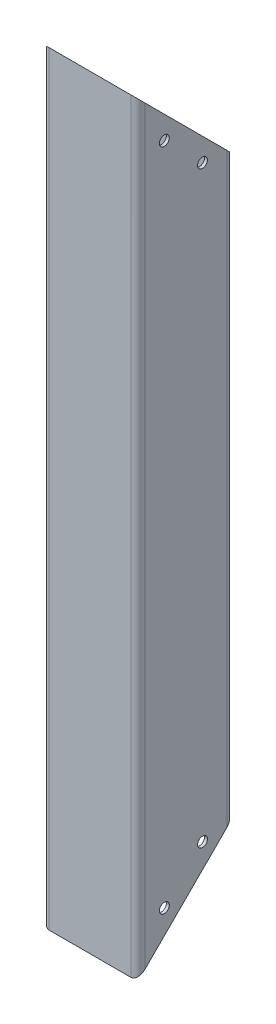
ISO-10303-21;
HEADER;
FILE_DESCRIPTION(('STEP AP214'),'2;1');
FILE_NAME('part.step','',(''),(''),'','','');
FILE_SCHEMA(('AUTOMOTIVE_DESIGN { 1 0 10303 214 1 1 1 1 }'));
ENDSEC;
DATA;
#1=APPLICATION_CONTEXT('core data for automotive mechanical design processes');
#2=APPLICATION_PROTOCOL_DEFINITION('international standard','automotive_design',2000,#1);
#3=PRODUCT_CONTEXT('',#1,'mechanical');
#4=PRODUCT('Part','Part','',(#3));
#5=PRODUCT_RELATED_PRODUCT_CATEGORY('part','',(#4));
#6=PRODUCT_DEFINITION_FORMATION('','',#4);
#7=PRODUCT_DEFINITION_CONTEXT('part definition',#1,'design');
#8=PRODUCT_DEFINITION('design','',#6,#7);
#9=PRODUCT_DEFINITION_SHAPE('','',#8);
#10=(LENGTH_UNIT() NAMED_UNIT(*) SI_UNIT(.MILLI.,.METRE.));
#11=(NAMED_UNIT(*) PLANE_ANGLE_UNIT() SI_UNIT($,.RADIAN.));
#12=(NAMED_UNIT(*) SI_UNIT($,.STERADIAN.) SOLID_ANGLE_UNIT());
#13=UNCERTAINTY_MEASURE_WITH_UNIT(LENGTH_MEASURE(1.E-05),#10,'distance_accuracy_value','');
#14=(GEOMETRIC_REPRESENTATION_CONTEXT(3) GLOBAL_UNCERTAINTY_ASSIGNED_CONTEXT((#13)) GLOBAL_UNIT_ASSIGNED_CONTEXT((#10,
#11,#12)) REPRESENTATION_CONTEXT('',''));
#15=CARTESIAN_POINT('',(0.,0.,0.));
#16=DIRECTION('',(0.,0.,1.));
#17=DIRECTION('',(1.,0.,0.));
#18=AXIS2_PLACEMENT_3D('',#15,#16,#17);
#19=CARTESIAN_POINT('',(-22.70125,425.,-22.70125));
#20=DIRECTION('',(0.,-1.,0.));
#21=DIRECTION('',(0.,0.,-1.));
#22=AXIS2_PLACEMENT_3D('',#19,#20,#21);
#23=CYLINDRICAL_SURFACE('',#22,3.96875);
#24=DIRECTION('',(0.,-1.,0.));
#25=VECTOR('',#24,1.);
#26=CARTESIAN_POINT('',(-22.70125,425.,-26.67));
#27=LINE('',#26,#25);
#28=CARTESIAN_POINT('',(-22.70125,371.659999999999,-26.67));
#29=VERTEX_POINT('',#28);
#30=CARTESIAN_POINT('',(-22.70125,53.3400000000006,-26.67));
#31=VERTEX_POINT('',#30);
#32=EDGE_CURVE('E207',#29,#31,#27,.T.);
#33=ORIENTED_EDGE('',*,*,#32,.T.);
#34=CARTESIAN_POINT('',(-22.70125,49.3712500000005,-22.70125));
#35=DIRECTION('',(0.,0.707106781186544,0.707106781186551));
#36=DIRECTION('',(0.,-0.707106781186551,0.707106781186544));
#37=AXIS2_PLACEMENT_3D('',#34,#35,#36);
#38=ELLIPSE('',#37,5.61266007566824,3.96875);
#39=CARTESIAN_POINT('',(-26.67,49.3712500000005,-22.70125));
#40=VERTEX_POINT('',#39);
#41=EDGE_CURVE('E305',#31,#40,#38,.T.);
#42=ORIENTED_EDGE('',*,*,#41,.T.);
#43=DIRECTION('',(0.,-1.,0.));
#44=VECTOR('',#43,1.);
#45=CARTESIAN_POINT('',(-26.67,425.,-22.70125));
#46=LINE('',#45,#44);
#47=CARTESIAN_POINT('',(-26.67,375.62875,-22.70125));
#48=VERTEX_POINT('',#47);
#49=EDGE_CURVE('E12',#48,#40,#46,.T.);
#50=ORIENTED_EDGE('',*,*,#49,.F.);
#51=CARTESIAN_POINT('',(-22.70125,375.62875,-22.70125));
#52=DIRECTION('',(0.,-0.707106781186544,0.707106781186551));
#53=DIRECTION('',(0.,-0.707106781186551,-0.707106781186544));
#54=AXIS2_PLACEMENT_3D('',#51,#52,#53);
#55=ELLIPSE('',#54,5.61266007566824,3.96875);
#56=EDGE_CURVE('E338',#48,#29,#55,.T.);
#57=ORIENTED_EDGE('',*,*,#56,.T.);
#58=EDGE_LOOP('',(#33,#42,#50,#57));
#59=FACE_BOUND('',#58,.T.);
#60=ADVANCED_FACE('F62',(#59),#23,.T.);
#61=CARTESIAN_POINT('',(-26.67,425.,-22.70125));
#62=DIRECTION('',(1.,0.,0.));
#63=DIRECTION('',(0.,0.,-1.));
#64=AXIS2_PLACEMENT_3D('',#61,#62,#63);
#65=PLANE('',#64);
#66=CARTESIAN_POINT('',(-26.67,397.622893218813,12.0208152801713));
#67=DIRECTION('',(1.,0.,0.));
#68=DIRECTION('',(0.,0.,-1.));
#69=AXIS2_PLACEMENT_3D('',#66,#67,#68);
#70=CIRCLE('',#69,2.74999999999997);
#71=CARTESIAN_POINT('',(-26.67,397.622893218813,9.27081528017132));
#72=VERTEX_POINT('',#71);
#73=EDGE_CURVE('E665',#72,#72,#70,.T.);
#74=ORIENTED_EDGE('',*,*,#73,.T.);
#75=EDGE_LOOP('',(#74));
#76=FACE_BOUND('',#75,.T.);
#77=CARTESIAN_POINT('',(-26.67,376.409689783217,-9.19238815542512));
#78=DIRECTION('',(1.,0.,0.));
#79=DIRECTION('',(0.,0.,-1.));
#80=AXIS2_PLACEMENT_3D('',#77,#78,#79);
#81=CIRCLE('',#80,2.74999999999997);
#82=CARTESIAN_POINT('',(-26.67,376.409689783217,-11.9423881554251));
#83=VERTEX_POINT('',#82);
#84=EDGE_CURVE('E249',#83,#83,#81,.T.);
#85=ORIENTED_EDGE('',*,*,#84,.T.);
#86=EDGE_LOOP('',(#85));
#87=FACE_BOUND('',#86,.T.);
#88=CARTESIAN_POINT('',(-26.67,28.0842135623737,12.0208152801713));
#89=DIRECTION('',(1.,0.,0.));
#90=DIRECTION('',(0.,0.,-1.));
#91=AXIS2_PLACEMENT_3D('',#88,#89,#90);
#92=CIRCLE('',#91,2.74999999999999);
#93=CARTESIAN_POINT('',(-26.67,28.0842135623737,9.27081528017127));
#94=VERTEX_POINT('',#93);
#95=EDGE_CURVE('E267',#94,#94,#92,.T.);
#96=ORIENTED_EDGE('',*,*,#95,.T.);
#97=EDGE_LOOP('',(#96));
#98=FACE_BOUND('',#97,.T.);
#99=CARTESIAN_POINT('',(-26.67,49.2974169979701,-9.19238815542515));
#100=DIRECTION('',(1.,0.,0.));
#101=DIRECTION('',(0.,0.,-1.));
#102=AXIS2_PLACEMENT_3D('',#99,#100,#101);
#103=CIRCLE('',#102,2.74999999999999);
#104=CARTESIAN_POINT('',(-26.67,49.2974169979701,-11.9423881554251));
#105=VERTEX_POINT('',#104);
#106=EDGE_CURVE('E245',#105,#105,#103,.T.);
#107=ORIENTED_EDGE('',*,*,#106,.T.);
#108=EDGE_LOOP('',(#107));
#109=FACE_BOUND('',#108,.T.);
#110=ORIENTED_EDGE('',*,*,#49,.T.);
#111=DIRECTION('',(0.,-0.707106781186551,0.707106781186544));
#112=VECTOR('',#111,1.);
#113=CARTESIAN_POINT('',(-26.67,0.,26.67));
#114=LINE('',#113,#112);
#115=CARTESIAN_POINT('',(-26.67,3.96875000000008,22.70125));
#116=VERTEX_POINT('',#115);
#117=EDGE_CURVE('E197',#40,#116,#114,.T.);
#118=ORIENTED_EDGE('',*,*,#117,.T.);
#119=DIRECTION('',(0.,-1.,0.));
#120=VECTOR('',#119,1.);
#121=CARTESIAN_POINT('',(-26.67,425.,22.70125));
#122=LINE('',#121,#120);
#123=CARTESIAN_POINT('',(-26.67,421.03125,22.70125));
#124=VERTEX_POINT('',#123);
#125=EDGE_CURVE('E71',#124,#116,#122,.T.);
#126=ORIENTED_EDGE('',*,*,#125,.F.);
#127=DIRECTION('',(0.,-0.707106781186551,-0.707106781186544));
#128=VECTOR('',#127,1.);
#129=CARTESIAN_POINT('',(-26.67,425.,26.67));
#130=LINE('',#129,#128);
#131=EDGE_CURVE('E309',#124,#48,#130,.T.);
#132=ORIENTED_EDGE('',*,*,#131,.T.);
#133=EDGE_LOOP('',(#110,#118,#126,#132));
#134=FACE_BOUND('',#133,.T.);
#135=ADVANCED_FACE('F363',(#76,#87,#98,#109,#134),#65,.F.);
#136=CARTESIAN_POINT('',(-22.70125,425.,22.70125));
#137=DIRECTION('',(0.,-1.,0.));
#138=DIRECTION('',(0.,0.,-1.));
#139=AXIS2_PLACEMENT_3D('',#136,#137,#138);
#140=CYLINDRICAL_SURFACE('',#139,3.96875);
#141=ORIENTED_EDGE('',*,*,#125,.T.);
#142=CARTESIAN_POINT('',(-22.70125,3.96875000000008,22.70125));
#143=DIRECTION('',(0.,0.707106781186544,0.707106781186551));
#144=DIRECTION('',(0.,-0.707106781186551,0.707106781186544));
#145=AXIS2_PLACEMENT_3D('',#142,#143,#144);
#146=ELLIPSE('',#145,5.61266007566825,3.96875);
#147=CARTESIAN_POINT('',(-22.70125,0.,26.67));
#148=VERTEX_POINT('',#147);
#149=EDGE_CURVE('E302',#116,#148,#146,.T.);
#150=ORIENTED_EDGE('',*,*,#149,.T.);
#151=DIRECTION('',(0.,-1.,0.));
#152=VECTOR('',#151,1.);
#153=CARTESIAN_POINT('',(-22.70125,425.,26.67));
#154=LINE('',#153,#152);
#155=CARTESIAN_POINT('',(-22.70125,425.,26.67));
#156=VERTEX_POINT('',#155);
#157=EDGE_CURVE('E213',#156,#148,#154,.T.);
#158=ORIENTED_EDGE('',*,*,#157,.F.);
#159=CARTESIAN_POINT('',(-22.70125,421.03125,22.70125));
#160=DIRECTION('',(0.,-0.707106781186544,0.707106781186551));
#161=DIRECTION('',(0.,-0.707106781186551,-0.707106781186544));
#162=AXIS2_PLACEMENT_3D('',#159,#160,#161);
#163=ELLIPSE('',#162,5.61266007566825,3.96875);
#164=EDGE_CURVE('E335',#156,#124,#163,.T.);
#165=ORIENTED_EDGE('',*,*,#164,.T.);
#166=EDGE_LOOP('',(#141,#150,#158,#165));
#167=FACE_BOUND('',#166,.T.);
#168=ADVANCED_FACE('F360',(#167),#140,.T.);
#169=CARTESIAN_POINT('',(22.70125,425.,26.67));
#170=DIRECTION('',(0.,0.,-1.));
#171=DIRECTION('',(-1.,0.,0.));
#172=AXIS2_PLACEMENT_3D('',#169,#170,#171);
#173=PLANE('',#172);
#174=DIRECTION('',(1.,0.,0.));
#175=VECTOR('',#174,1.);
#176=CARTESIAN_POINT('',(22.70125,0.,26.67));
#177=LINE('',#176,#175);
#178=CARTESIAN_POINT('',(22.70125,0.,26.67));
#179=VERTEX_POINT('',#178);
#180=EDGE_CURVE('E341',#148,#179,#177,.T.);
#181=ORIENTED_EDGE('',*,*,#180,.T.);
#182=DIRECTION('',(0.,-1.,0.));
#183=VECTOR('',#182,1.);
#184=CARTESIAN_POINT('',(22.70125,425.,26.67));
#185=LINE('',#184,#183);
#186=CARTESIAN_POINT('',(22.70125,425.,26.67));
#187=VERTEX_POINT('',#186);
#188=EDGE_CURVE('E205',#187,#179,#185,.T.);
#189=ORIENTED_EDGE('',*,*,#188,.F.);
#190=DIRECTION('',(1.,0.,0.));
#191=VECTOR('',#190,1.);
#192=CARTESIAN_POINT('',(22.70125,425.,26.67));
#193=LINE('',#192,#191);
#194=EDGE_CURVE('E222',#156,#187,#193,.T.);
#195=ORIENTED_EDGE('',*,*,#194,.F.);
#196=ORIENTED_EDGE('',*,*,#157,.T.);
#197=EDGE_LOOP('',(#181,#189,#195,#196));
#198=FACE_BOUND('',#197,.T.);
#199=ADVANCED_FACE('F356',(#198),#173,.F.);
#200=CARTESIAN_POINT('',(22.70125,425.,22.70125));
#201=DIRECTION('',(0.,-1.,0.));
#202=DIRECTION('',(0.,0.,-1.));
#203=AXIS2_PLACEMENT_3D('',#200,#201,#202);
#204=CYLINDRICAL_SURFACE('',#203,3.96875);
#205=ORIENTED_EDGE('',*,*,#188,.T.);
#206=CARTESIAN_POINT('',(22.70125,3.96875000000013,22.70125));
#207=DIRECTION('',(0.,0.707106781186544,0.707106781186551));
#208=DIRECTION('',(0.,-0.707106781186551,0.707106781186544));
#209=AXIS2_PLACEMENT_3D('',#206,#207,#208);
#210=ELLIPSE('',#209,5.61266007566825,3.96875);
#211=CARTESIAN_POINT('',(26.67,3.96875000000011,22.70125));
#212=VERTEX_POINT('',#211);
#213=EDGE_CURVE('E187',#179,#212,#210,.T.);
#214=ORIENTED_EDGE('',*,*,#213,.T.);
#215=DIRECTION('',(0.,-1.,0.));
#216=VECTOR('',#215,1.);
#217=CARTESIAN_POINT('',(26.67,425.,22.70125));
#218=LINE('',#217,#216);
#219=CARTESIAN_POINT('',(26.67,421.03125,22.70125));
#220=VERTEX_POINT('',#219);
#221=EDGE_CURVE('E196',#220,#212,#218,.T.);
#222=ORIENTED_EDGE('',*,*,#221,.F.);
#223=CARTESIAN_POINT('',(22.70125,421.03125,22.70125));
#224=DIRECTION('',(0.,-0.707106781186544,0.707106781186551));
#225=DIRECTION('',(0.,-0.707106781186551,-0.707106781186544));
#226=AXIS2_PLACEMENT_3D('',#223,#224,#225);
#227=ELLIPSE('',#226,5.61266007566825,3.96875);
#228=EDGE_CURVE('E332',#220,#187,#227,.T.);
#229=ORIENTED_EDGE('',*,*,#228,.T.);
#230=EDGE_LOOP('',(#205,#214,#222,#229));
#231=FACE_BOUND('',#230,.T.);
#232=ADVANCED_FACE('F353',(#231),#204,.T.);
#233=CARTESIAN_POINT('',(26.67,425.,-22.70125));
#234=DIRECTION('',(-1.,0.,0.));
#235=DIRECTION('',(0.,0.,1.));
#236=AXIS2_PLACEMENT_3D('',#233,#234,#235);
#237=PLANE('',#236);
#238=CARTESIAN_POINT('',(26.67,397.622893218813,12.0208152801713));
#239=DIRECTION('',(1.,0.,0.));
#240=DIRECTION('',(0.,0.,-1.));
#241=AXIS2_PLACEMENT_3D('',#238,#239,#240);
#242=CIRCLE('',#241,2.74999999999997);
#243=CARTESIAN_POINT('',(26.67,397.622893218813,9.27081528017132));
#244=VERTEX_POINT('',#243);
#245=EDGE_CURVE('E664',#244,#244,#242,.T.);
#246=ORIENTED_EDGE('',*,*,#245,.F.);
#247=EDGE_LOOP('',(#246));
#248=FACE_BOUND('',#247,.T.);
#249=CARTESIAN_POINT('',(26.67,376.409689783217,-9.19238815542512));
#250=DIRECTION('',(1.,0.,0.));
#251=DIRECTION('',(0.,0.,-1.));
#252=AXIS2_PLACEMENT_3D('',#249,#250,#251);
#253=CIRCLE('',#252,2.74999999999997);
#254=CARTESIAN_POINT('',(26.67,376.409689783217,-11.9423881554251));
#255=VERTEX_POINT('',#254);
#256=EDGE_CURVE('E256',#255,#255,#253,.T.);
#257=ORIENTED_EDGE('',*,*,#256,.F.);
#258=EDGE_LOOP('',(#257));
#259=FACE_BOUND('',#258,.T.);
#260=CARTESIAN_POINT('',(26.67,28.0842135623737,12.0208152801713));
#261=DIRECTION('',(1.,0.,0.));
#262=DIRECTION('',(0.,0.,-1.));
#263=AXIS2_PLACEMENT_3D('',#260,#261,#262);
#264=CIRCLE('',#263,2.74999999999999);
#265=CARTESIAN_POINT('',(26.67,28.0842135623737,9.27081528017127));
#266=VERTEX_POINT('',#265);
#267=EDGE_CURVE('E253',#266,#266,#264,.T.);
#268=ORIENTED_EDGE('',*,*,#267,.F.);
#269=EDGE_LOOP('',(#268));
#270=FACE_BOUND('',#269,.T.);
#271=CARTESIAN_POINT('',(26.67,49.2974169979701,-9.19238815542515));
#272=DIRECTION('',(1.,0.,0.));
#273=DIRECTION('',(0.,0.,-1.));
#274=AXIS2_PLACEMENT_3D('',#271,#272,#273);
#275=CIRCLE('',#274,2.75);
#276=CARTESIAN_POINT('',(26.67,49.2974169979701,-11.9423881554251));
#277=VERTEX_POINT('',#276);
#278=EDGE_CURVE('E276',#277,#277,#275,.T.);
#279=ORIENTED_EDGE('',*,*,#278,.F.);
#280=EDGE_LOOP('',(#279));
#281=FACE_BOUND('',#280,.T.);
#282=ORIENTED_EDGE('',*,*,#221,.T.);
#283=DIRECTION('',(0.,-0.707106781186551,0.707106781186544));
#284=VECTOR('',#283,1.);
#285=CARTESIAN_POINT('',(26.67,0.,26.67));
#286=LINE('',#285,#284);
#287=CARTESIAN_POINT('',(26.67,49.3712500000006,-22.70125));
#288=VERTEX_POINT('',#287);
#289=EDGE_CURVE('E179',#288,#212,#286,.T.);
#290=ORIENTED_EDGE('',*,*,#289,.F.);
#291=DIRECTION('',(0.,-1.,0.));
#292=VECTOR('',#291,1.);
#293=CARTESIAN_POINT('',(26.67,425.,-22.70125));
#294=LINE('',#293,#292);
#295=CARTESIAN_POINT('',(26.67,375.628749999999,-22.70125));
#296=VERTEX_POINT('',#295);
#297=EDGE_CURVE('E194',#296,#288,#294,.T.);
#298=ORIENTED_EDGE('',*,*,#297,.F.);
#299=DIRECTION('',(0.,-0.707106781186551,-0.707106781186544));
#300=VECTOR('',#299,1.);
#301=CARTESIAN_POINT('',(26.67,425.,26.67));
#302=LINE('',#301,#300);
#303=EDGE_CURVE('E308',#220,#296,#302,.T.);
#304=ORIENTED_EDGE('',*,*,#303,.F.);
#305=EDGE_LOOP('',(#282,#290,#298,#304));
#306=FACE_BOUND('',#305,.T.);
#307=ADVANCED_FACE('F192',(#248,#259,#270,#281,#306),#237,.F.);
#308=CARTESIAN_POINT('',(22.70125,425.,-22.70125));
#309=DIRECTION('',(0.,-1.,0.));
#310=DIRECTION('',(0.,0.,-1.));
#311=AXIS2_PLACEMENT_3D('',#308,#309,#310);
#312=CYLINDRICAL_SURFACE('',#311,3.96875);
#313=ORIENTED_EDGE('',*,*,#297,.T.);
#314=CARTESIAN_POINT('',(22.70125,49.3712500000005,-22.70125));
#315=DIRECTION('',(0.,0.707106781186544,0.707106781186551));
#316=DIRECTION('',(0.,-0.707106781186551,0.707106781186544));
#317=AXIS2_PLACEMENT_3D('',#314,#315,#316);
#318=ELLIPSE('',#317,5.61266007566825,3.96875);
#319=CARTESIAN_POINT('',(22.70125,53.3400000000006,-26.67));
#320=VERTEX_POINT('',#319);
#321=EDGE_CURVE('E176',#288,#320,#318,.T.);
#322=ORIENTED_EDGE('',*,*,#321,.T.);
#323=DIRECTION('',(0.,-1.,0.));
#324=VECTOR('',#323,1.);
#325=CARTESIAN_POINT('',(22.70125,425.,-26.67));
#326=LINE('',#325,#324);
#327=CARTESIAN_POINT('',(22.70125,371.659999999999,-26.67));
#328=VERTEX_POINT('',#327);
#329=EDGE_CURVE('E203',#328,#320,#326,.T.);
#330=ORIENTED_EDGE('',*,*,#329,.F.);
#331=CARTESIAN_POINT('',(22.70125,375.62875,-22.70125));
#332=DIRECTION('',(0.,-0.707106781186544,0.707106781186551));
#333=DIRECTION('',(0.,-0.707106781186551,-0.707106781186544));
#334=AXIS2_PLACEMENT_3D('',#331,#332,#333);
#335=ELLIPSE('',#334,5.61266007566825,3.96875);
#336=EDGE_CURVE('E202',#328,#296,#335,.T.);
#337=ORIENTED_EDGE('',*,*,#336,.T.);
#338=EDGE_LOOP('',(#313,#322,#330,#337));
#339=FACE_BOUND('',#338,.T.);
#340=ADVANCED_FACE('F201',(#339),#312,.T.);
#341=CARTESIAN_POINT('',(22.70125,425.,-22.70125));
#342=DIRECTION('',(0.,-1.,0.));
#343=DIRECTION('',(0.,0.,-1.));
#344=AXIS2_PLACEMENT_3D('',#341,#342,#343);
#345=CYLINDRICAL_SURFACE('',#344,2.31775);
#346=CARTESIAN_POINT('',(22.70125,49.3712500000005,-22.70125));
#347=DIRECTION('',(0.,0.707106781186544,0.707106781186551));
#348=DIRECTION('',(0.,-0.707106781186551,0.707106781186544));
#349=AXIS2_PLACEMENT_3D('',#346,#347,#348);
#350=ELLIPSE('',#349,3.27779348419026,2.31775);
#351=CARTESIAN_POINT('',(25.019,49.3712500000005,-22.70125));
#352=VERTEX_POINT('',#351);
#353=CARTESIAN_POINT('',(22.70125,51.6890000000006,-25.019));
#354=VERTEX_POINT('',#353);
#355=EDGE_CURVE('E79',#352,#354,#350,.T.);
#356=ORIENTED_EDGE('',*,*,#355,.F.);
#357=DIRECTION('',(0.,-1.,0.));
#358=VECTOR('',#357,1.);
#359=CARTESIAN_POINT('',(25.019,425.,-22.70125));
#360=LINE('',#359,#358);
#361=CARTESIAN_POINT('',(25.019,375.62875,-22.70125));
#362=VERTEX_POINT('',#361);
#363=EDGE_CURVE('E240',#362,#352,#360,.T.);
#364=ORIENTED_EDGE('',*,*,#363,.F.);
#365=CARTESIAN_POINT('',(22.70125,375.62875,-22.70125));
#366=DIRECTION('',(0.,-0.707106781186544,0.707106781186551));
#367=DIRECTION('',(0.,-0.707106781186551,-0.707106781186544));
#368=AXIS2_PLACEMENT_3D('',#365,#366,#367);
#369=ELLIPSE('',#368,3.27779348419026,2.31775);
#370=CARTESIAN_POINT('',(22.70125,373.310999999999,-25.019));
#371=VERTEX_POINT('',#370);
#372=EDGE_CURVE('E329',#371,#362,#369,.T.);
#373=ORIENTED_EDGE('',*,*,#372,.F.);
#374=DIRECTION('',(0.,-1.,0.));
#375=VECTOR('',#374,1.);
#376=CARTESIAN_POINT('',(22.70125,425.,-25.019));
#377=LINE('',#376,#375);
#378=EDGE_CURVE('E218',#371,#354,#377,.T.);
#379=ORIENTED_EDGE('',*,*,#378,.T.);
#380=EDGE_LOOP('',(#356,#364,#373,#379));
#381=FACE_BOUND('',#380,.T.);
#382=ADVANCED_FACE('F64',(#381),#345,.F.);
#383=CARTESIAN_POINT('',(25.019,425.,-22.70125));
#384=DIRECTION('',(-1.,0.,0.));
#385=DIRECTION('',(0.,0.,1.));
#386=AXIS2_PLACEMENT_3D('',#383,#384,#385);
#387=PLANE('',#386);
#388=CARTESIAN_POINT('',(25.019,397.622893218813,12.0208152801713));
#389=DIRECTION('',(-1.,0.,0.));
#390=DIRECTION('',(0.,0.,1.));
#391=AXIS2_PLACEMENT_3D('',#388,#389,#390);
#392=CIRCLE('',#391,2.74999999999997);
#393=CARTESIAN_POINT('',(25.019,397.622893218813,14.7708152801713));
#394=VERTEX_POINT('',#393);
#395=EDGE_CURVE('E261',#394,#394,#392,.T.);
#396=ORIENTED_EDGE('',*,*,#395,.F.);
#397=EDGE_LOOP('',(#396));
#398=FACE_BOUND('',#397,.T.);
#399=CARTESIAN_POINT('',(25.019,376.409689783217,-9.19238815542512));
#400=DIRECTION('',(-1.,0.,0.));
#401=DIRECTION('',(0.,0.,1.));
#402=AXIS2_PLACEMENT_3D('',#399,#400,#401);
#403=CIRCLE('',#402,2.74999999999997);
#404=CARTESIAN_POINT('',(25.019,376.409689783217,-6.44238815542514));
#405=VERTEX_POINT('',#404);
#406=EDGE_CURVE('E248',#405,#405,#403,.T.);
#407=ORIENTED_EDGE('',*,*,#406,.F.);
#408=EDGE_LOOP('',(#407));
#409=FACE_BOUND('',#408,.T.);
#410=CARTESIAN_POINT('',(25.019,28.0842135623737,12.0208152801713));
#411=DIRECTION('',(-1.,0.,0.));
#412=DIRECTION('',(0.,0.,1.));
#413=AXIS2_PLACEMENT_3D('',#410,#411,#412);
#414=CIRCLE('',#413,2.74999999999999);
#415=CARTESIAN_POINT('',(25.019,28.0842135623737,14.7708152801713));
#416=VERTEX_POINT('',#415);
#417=EDGE_CURVE('E273',#416,#416,#414,.T.);
#418=ORIENTED_EDGE('',*,*,#417,.F.);
#419=EDGE_LOOP('',(#418));
#420=FACE_BOUND('',#419,.T.);
#421=CARTESIAN_POINT('',(25.019,49.2974169979701,-9.19238815542515));
#422=DIRECTION('',(-1.,0.,0.));
#423=DIRECTION('',(0.,0.,1.));
#424=AXIS2_PLACEMENT_3D('',#421,#422,#423);
#425=CIRCLE('',#424,2.74999999999999);
#426=CARTESIAN_POINT('',(25.019,49.2974169979701,-6.44238815542516));
#427=VERTEX_POINT('',#426);
#428=EDGE_CURVE('E198',#427,#427,#425,.T.);
#429=ORIENTED_EDGE('',*,*,#428,.F.);
#430=EDGE_LOOP('',(#429));
#431=FACE_BOUND('',#430,.T.);
#432=DIRECTION('',(0.,0.707106781186551,-0.707106781186544));
#433=VECTOR('',#432,1.);
#434=CARTESIAN_POINT('',(25.019,237.185625000002,-210.515625));
#435=LINE('',#434,#433);
#436=CARTESIAN_POINT('',(25.019,3.96875000000013,22.70125));
#437=VERTEX_POINT('',#436);
#438=EDGE_CURVE('E298',#437,#352,#435,.T.);
#439=ORIENTED_EDGE('',*,*,#438,.F.);
#440=DIRECTION('',(0.,-1.,0.));
#441=VECTOR('',#440,1.);
#442=CARTESIAN_POINT('',(25.019,425.,22.70125));
#443=LINE('',#442,#441);
#444=CARTESIAN_POINT('',(25.019,421.03125,22.70125));
#445=VERTEX_POINT('',#444);
#446=EDGE_CURVE('E237',#445,#437,#443,.T.);
#447=ORIENTED_EDGE('',*,*,#446,.F.);
#448=DIRECTION('',(0.,0.707106781186551,0.707106781186544));
#449=VECTOR('',#448,1.);
#450=CARTESIAN_POINT('',(25.019,400.314375,1.98437500000024));
#451=LINE('',#450,#449);
#452=EDGE_CURVE('E327',#362,#445,#451,.T.);
#453=ORIENTED_EDGE('',*,*,#452,.F.);
#454=ORIENTED_EDGE('',*,*,#363,.T.);
#455=EDGE_LOOP('',(#439,#447,#453,#454));
#456=FACE_BOUND('',#455,.T.);
#457=ADVANCED_FACE('F398',(#398,#409,#420,#431,#456),#387,.T.);
#458=CARTESIAN_POINT('',(22.70125,425.,22.70125));
#459=DIRECTION('',(0.,-1.,0.));
#460=DIRECTION('',(0.,0.,-1.));
#461=AXIS2_PLACEMENT_3D('',#458,#459,#460);
#462=CYLINDRICAL_SURFACE('',#461,2.31775);
#463=CARTESIAN_POINT('',(22.70125,3.96875000000013,22.70125));
#464=DIRECTION('',(0.,0.707106781186544,0.707106781186551));
#465=DIRECTION('',(0.,-0.707106781186551,0.707106781186544));
#466=AXIS2_PLACEMENT_3D('',#463,#464,#465);
#467=ELLIPSE('',#466,3.27779348419026,2.31775);
#468=CARTESIAN_POINT('',(22.70125,1.65100000000007,25.019));
#469=VERTEX_POINT('',#468);
#470=EDGE_CURVE('E296',#469,#437,#467,.T.);
#471=ORIENTED_EDGE('',*,*,#470,.F.);
#472=DIRECTION('',(0.,-1.,0.));
#473=VECTOR('',#472,1.);
#474=CARTESIAN_POINT('',(22.70125,425.,25.019));
#475=LINE('',#474,#473);
#476=CARTESIAN_POINT('',(22.70125,423.349,25.019));
#477=VERTEX_POINT('',#476);
#478=EDGE_CURVE('E234',#477,#469,#475,.T.);
#479=ORIENTED_EDGE('',*,*,#478,.F.);
#480=CARTESIAN_POINT('',(22.70125,421.03125,22.70125));
#481=DIRECTION('',(0.,-0.707106781186544,0.707106781186551));
#482=DIRECTION('',(0.,-0.707106781186551,-0.707106781186544));
#483=AXIS2_PLACEMENT_3D('',#480,#481,#482);
#484=ELLIPSE('',#483,3.27779348419026,2.31775);
#485=EDGE_CURVE('E325',#445,#477,#484,.T.);
#486=ORIENTED_EDGE('',*,*,#485,.F.);
#487=ORIENTED_EDGE('',*,*,#446,.T.);
#488=EDGE_LOOP('',(#471,#479,#486,#487));
#489=FACE_BOUND('',#488,.T.);
#490=ADVANCED_FACE('F395',(#489),#462,.F.);
#491=CARTESIAN_POINT('',(22.70125,425.,25.019));
#492=DIRECTION('',(0.,0.,-1.));
#493=DIRECTION('',(-1.,0.,0.));
#494=AXIS2_PLACEMENT_3D('',#491,#492,#493);
#495=PLANE('',#494);
#496=DIRECTION('',(1.,0.,0.));
#497=VECTOR('',#496,1.);
#498=CARTESIAN_POINT('',(22.7012500000001,1.65100000000007,25.019));
#499=LINE('',#498,#497);
#500=CARTESIAN_POINT('',(-22.70125,1.65100000000007,25.019));
#501=VERTEX_POINT('',#500);
#502=EDGE_CURVE('E294',#501,#469,#499,.T.);
#503=ORIENTED_EDGE('',*,*,#502,.F.);
#504=DIRECTION('',(0.,-1.,0.));
#505=VECTOR('',#504,1.);
#506=CARTESIAN_POINT('',(-22.70125,425.,25.019));
#507=LINE('',#506,#505);
#508=CARTESIAN_POINT('',(-22.70125,423.349,25.019));
#509=VERTEX_POINT('',#508);
#510=EDGE_CURVE('E231',#509,#501,#507,.T.);
#511=ORIENTED_EDGE('',*,*,#510,.F.);
#512=DIRECTION('',(-1.,0.,0.));
#513=VECTOR('',#512,1.);
#514=CARTESIAN_POINT('',(22.70125,423.349,25.019));
#515=LINE('',#514,#513);
#516=EDGE_CURVE('E323',#477,#509,#515,.T.);
#517=ORIENTED_EDGE('',*,*,#516,.F.);
#518=ORIENTED_EDGE('',*,*,#478,.T.);
#519=EDGE_LOOP('',(#503,#511,#517,#518));
#520=FACE_BOUND('',#519,.T.);
#521=ADVANCED_FACE('F391',(#520),#495,.T.);
#522=CARTESIAN_POINT('',(-22.70125,425.,22.70125));
#523=DIRECTION('',(0.,-1.,0.));
#524=DIRECTION('',(0.,0.,-1.));
#525=AXIS2_PLACEMENT_3D('',#522,#523,#524);
#526=CYLINDRICAL_SURFACE('',#525,2.31775);
#527=CARTESIAN_POINT('',(-22.70125,3.96875000000008,22.70125));
#528=DIRECTION('',(0.,0.707106781186544,0.707106781186551));
#529=DIRECTION('',(0.,-0.707106781186551,0.707106781186544));
#530=AXIS2_PLACEMENT_3D('',#527,#528,#529);
#531=ELLIPSE('',#530,3.27779348419026,2.31775);
#532=CARTESIAN_POINT('',(-25.019,3.9687500000001,22.70125));
#533=VERTEX_POINT('',#532);
#534=EDGE_CURVE('E292',#533,#501,#531,.T.);
#535=ORIENTED_EDGE('',*,*,#534,.F.);
#536=DIRECTION('',(0.,-1.,0.));
#537=VECTOR('',#536,1.);
#538=CARTESIAN_POINT('',(-25.019,425.,22.70125));
#539=LINE('',#538,#537);
#540=CARTESIAN_POINT('',(-25.019,421.03125,22.70125));
#541=VERTEX_POINT('',#540);
#542=EDGE_CURVE('E228',#541,#533,#539,.T.);
#543=ORIENTED_EDGE('',*,*,#542,.F.);
#544=CARTESIAN_POINT('',(-22.70125,421.03125,22.70125));
#545=DIRECTION('',(0.,-0.707106781186544,0.707106781186551));
#546=DIRECTION('',(0.,-0.707106781186551,-0.707106781186544));
#547=AXIS2_PLACEMENT_3D('',#544,#545,#546);
#548=ELLIPSE('',#547,3.27779348419026,2.31775);
#549=EDGE_CURVE('E321',#509,#541,#548,.T.);
#550=ORIENTED_EDGE('',*,*,#549,.F.);
#551=ORIENTED_EDGE('',*,*,#510,.T.);
#552=EDGE_LOOP('',(#535,#543,#550,#551));
#553=FACE_BOUND('',#552,.T.);
#554=ADVANCED_FACE('F387',(#553),#526,.F.);
#555=CARTESIAN_POINT('',(-25.019,425.,-22.70125));
#556=DIRECTION('',(1.,0.,0.));
#557=DIRECTION('',(0.,0.,-1.));
#558=AXIS2_PLACEMENT_3D('',#555,#556,#557);
#559=PLANE('',#558);
#560=CARTESIAN_POINT('',(-25.019,397.622893218813,12.0208152801713));
#561=DIRECTION('',(1.,0.,0.));
#562=DIRECTION('',(0.,0.,-1.));
#563=AXIS2_PLACEMENT_3D('',#560,#561,#562);
#564=CIRCLE('',#563,2.74999999999997);
#565=CARTESIAN_POINT('',(-25.019,397.622893218813,9.27081528017132));
#566=VERTEX_POINT('',#565);
#567=EDGE_CURVE('E66',#566,#566,#564,.T.);
#568=ORIENTED_EDGE('',*,*,#567,.F.);
#569=EDGE_LOOP('',(#568));
#570=FACE_BOUND('',#569,.T.);
#571=CARTESIAN_POINT('',(-25.019,376.409689783217,-9.19238815542512));
#572=DIRECTION('',(1.,0.,0.));
#573=DIRECTION('',(0.,0.,-1.));
#574=AXIS2_PLACEMENT_3D('',#571,#572,#573);
#575=CIRCLE('',#574,2.74999999999997);
#576=CARTESIAN_POINT('',(-25.019,376.409689783217,-11.9423881554251));
#577=VERTEX_POINT('',#576);
#578=EDGE_CURVE('E246',#577,#577,#575,.T.);
#579=ORIENTED_EDGE('',*,*,#578,.F.);
#580=EDGE_LOOP('',(#579));
#581=FACE_BOUND('',#580,.T.);
#582=CARTESIAN_POINT('',(-25.019,28.0842135623737,12.0208152801713));
#583=DIRECTION('',(1.,0.,0.));
#584=DIRECTION('',(0.,0.,-1.));
#585=AXIS2_PLACEMENT_3D('',#582,#583,#584);
#586=CIRCLE('',#585,2.74999999999999);
#587=CARTESIAN_POINT('',(-25.019,28.0842135623737,9.27081528017127));
#588=VERTEX_POINT('',#587);
#589=EDGE_CURVE('E270',#588,#588,#586,.T.);
#590=ORIENTED_EDGE('',*,*,#589,.F.);
#591=EDGE_LOOP('',(#590));
#592=FACE_BOUND('',#591,.T.);
#593=CARTESIAN_POINT('',(-25.019,49.2974169979701,-9.19238815542515));
#594=DIRECTION('',(1.,0.,0.));
#595=DIRECTION('',(0.,0.,-1.));
#596=AXIS2_PLACEMENT_3D('',#593,#594,#595);
#597=CIRCLE('',#596,2.74999999999999);
#598=CARTESIAN_POINT('',(-25.019,49.2974169979701,-11.9423881554251));
#599=VERTEX_POINT('',#598);
#600=EDGE_CURVE('E243',#599,#599,#597,.T.);
#601=ORIENTED_EDGE('',*,*,#600,.F.);
#602=EDGE_LOOP('',(#601));
#603=FACE_BOUND('',#602,.T.);
#604=DIRECTION('',(0.,-0.707106781186551,0.707106781186544));
#605=VECTOR('',#604,1.);
#606=CARTESIAN_POINT('',(-25.019,237.185625000002,-210.515625));
#607=LINE('',#606,#605);
#608=CARTESIAN_POINT('',(-25.019,49.3712500000005,-22.70125));
#609=VERTEX_POINT('',#608);
#610=EDGE_CURVE('E290',#609,#533,#607,.T.);
#611=ORIENTED_EDGE('',*,*,#610,.F.);
#612=DIRECTION('',(0.,-1.,0.));
#613=VECTOR('',#612,1.);
#614=CARTESIAN_POINT('',(-25.019,425.,-22.70125));
#615=LINE('',#614,#613);
#616=CARTESIAN_POINT('',(-25.019,375.62875,-22.70125));
#617=VERTEX_POINT('',#616);
#618=EDGE_CURVE('E225',#617,#609,#615,.T.);
#619=ORIENTED_EDGE('',*,*,#618,.F.);
#620=DIRECTION('',(0.,-0.707106781186551,-0.707106781186544));
#621=VECTOR('',#620,1.);
#622=CARTESIAN_POINT('',(-25.019,400.314375,1.98437500000025));
#623=LINE('',#622,#621);
#624=EDGE_CURVE('E319',#541,#617,#623,.T.);
#625=ORIENTED_EDGE('',*,*,#624,.F.);
#626=ORIENTED_EDGE('',*,*,#542,.T.);
#627=EDGE_LOOP('',(#611,#619,#625,#626));
#628=FACE_BOUND('',#627,.T.);
#629=ADVANCED_FACE('F383',(#570,#581,#592,#603,#628),#559,.T.);
#630=CARTESIAN_POINT('',(-22.70125,425.,-22.70125));
#631=DIRECTION('',(0.,-1.,0.));
#632=DIRECTION('',(0.,0.,-1.));
#633=AXIS2_PLACEMENT_3D('',#630,#631,#632);
#634=CYLINDRICAL_SURFACE('',#633,2.31775);
#635=CARTESIAN_POINT('',(-22.70125,49.3712500000005,-22.70125));
#636=DIRECTION('',(0.,0.707106781186544,0.707106781186551));
#637=DIRECTION('',(0.,-0.707106781186551,0.707106781186544));
#638=AXIS2_PLACEMENT_3D('',#635,#636,#637);
#639=ELLIPSE('',#638,3.27779348419026,2.31775);
#640=CARTESIAN_POINT('',(-22.70125,51.6890000000006,-25.019));
#641=VERTEX_POINT('',#640);
#642=EDGE_CURVE('E288',#641,#609,#639,.T.);
#643=ORIENTED_EDGE('',*,*,#642,.F.);
#644=DIRECTION('',(0.,-1.,0.));
#645=VECTOR('',#644,1.);
#646=CARTESIAN_POINT('',(-22.70125,425.,-25.019));
#647=LINE('',#646,#645);
#648=CARTESIAN_POINT('',(-22.70125,373.310999999999,-25.019));
#649=VERTEX_POINT('',#648);
#650=EDGE_CURVE('E221',#649,#641,#647,.T.);
#651=ORIENTED_EDGE('',*,*,#650,.F.);
#652=CARTESIAN_POINT('',(-22.70125,375.62875,-22.70125));
#653=DIRECTION('',(0.,-0.707106781186544,0.707106781186551));
#654=DIRECTION('',(0.,-0.707106781186551,-0.707106781186544));
#655=AXIS2_PLACEMENT_3D('',#652,#653,#654);
#656=ELLIPSE('',#655,3.27779348419026,2.31775);
#657=EDGE_CURVE('E87',#617,#649,#656,.T.);
#658=ORIENTED_EDGE('',*,*,#657,.F.);
#659=ORIENTED_EDGE('',*,*,#618,.T.);
#660=EDGE_LOOP('',(#643,#651,#658,#659));
#661=FACE_BOUND('',#660,.T.);
#662=ADVANCED_FACE('F379',(#661),#634,.F.);
#663=CARTESIAN_POINT('',(22.70125,425.,-25.019));
#664=DIRECTION('',(0.,0.,1.));
#665=DIRECTION('',(1.,0.,0.));
#666=AXIS2_PLACEMENT_3D('',#663,#664,#665);
#667=PLANE('',#666);
#668=DIRECTION('',(-1.,0.,0.));
#669=VECTOR('',#668,1.);
#670=CARTESIAN_POINT('',(22.70125,51.6890000000006,-25.019));
#671=LINE('',#670,#669);
#672=EDGE_CURVE('E286',#354,#641,#671,.T.);
#673=ORIENTED_EDGE('',*,*,#672,.F.);
#674=ORIENTED_EDGE('',*,*,#378,.F.);
#675=DIRECTION('',(1.,0.,0.));
#676=VECTOR('',#675,1.);
#677=CARTESIAN_POINT('',(22.70125,373.310999999999,-25.019));
#678=LINE('',#677,#676);
#679=EDGE_CURVE('E316',#649,#371,#678,.T.);
#680=ORIENTED_EDGE('',*,*,#679,.F.);
#681=ORIENTED_EDGE('',*,*,#650,.T.);
#682=EDGE_LOOP('',(#673,#674,#680,#681));
#683=FACE_BOUND('',#682,.T.);
#684=ADVANCED_FACE('F376',(#683),#667,.T.);
#685=CARTESIAN_POINT('',(22.70125,425.,-26.67));
#686=DIRECTION('',(0.,0.,1.));
#687=DIRECTION('',(1.,0.,0.));
#688=AXIS2_PLACEMENT_3D('',#685,#686,#687);
#689=PLANE('',#688);
#690=ORIENTED_EDGE('',*,*,#329,.T.);
#691=DIRECTION('',(1.,0.,0.));
#692=VECTOR('',#691,1.);
#693=CARTESIAN_POINT('',(-26.67,53.3400000000006,-26.67));
#694=LINE('',#693,#692);
#695=EDGE_CURVE('E182',#31,#320,#694,.T.);
#696=ORIENTED_EDGE('',*,*,#695,.F.);
#697=ORIENTED_EDGE('',*,*,#32,.F.);
#698=DIRECTION('',(1.,0.,0.));
#699=VECTOR('',#698,1.);
#700=CARTESIAN_POINT('',(-26.67,371.659999999999,-26.67));
#701=LINE('',#700,#699);
#702=EDGE_CURVE('E312',#29,#328,#701,.T.);
#703=ORIENTED_EDGE('',*,*,#702,.T.);
#704=EDGE_LOOP('',(#690,#696,#697,#703));
#705=FACE_BOUND('',#704,.T.);
#706=ADVANCED_FACE('F349',(#705),#689,.F.);
#707=CARTESIAN_POINT('',(-26.67,425.,26.67));
#708=DIRECTION('',(0.,-0.707106781186544,0.707106781186551));
#709=DIRECTION('',(0.,-0.707106781186551,-0.707106781186544));
#710=AXIS2_PLACEMENT_3D('',#707,#708,#709);
#711=PLANE('',#710);
#712=ORIENTED_EDGE('',*,*,#372,.T.);
#713=ORIENTED_EDGE('',*,*,#452,.T.);
#714=ORIENTED_EDGE('',*,*,#485,.T.);
#715=ORIENTED_EDGE('',*,*,#516,.T.);
#716=ORIENTED_EDGE('',*,*,#549,.T.);
#717=ORIENTED_EDGE('',*,*,#624,.T.);
#718=ORIENTED_EDGE('',*,*,#657,.T.);
#719=ORIENTED_EDGE('',*,*,#679,.T.);
#720=EDGE_LOOP('',(#712,#713,#714,#715,#716,#717,#718,#719));
#721=FACE_BOUND('',#720,.T.);
#722=ORIENTED_EDGE('',*,*,#131,.F.);
#723=ORIENTED_EDGE('',*,*,#164,.F.);
#724=ORIENTED_EDGE('',*,*,#194,.T.);
#725=ORIENTED_EDGE('',*,*,#228,.F.);
#726=ORIENTED_EDGE('',*,*,#303,.T.);
#727=ORIENTED_EDGE('',*,*,#336,.F.);
#728=ORIENTED_EDGE('',*,*,#702,.F.);
#729=ORIENTED_EDGE('',*,*,#56,.F.);
#730=EDGE_LOOP('',(#722,#723,#724,#725,#726,#727,#728,#729));
#731=FACE_BOUND('',#730,.T.);
#732=ADVANCED_FACE('F351',(#721,#731),#711,.F.);
#733=CARTESIAN_POINT('',(-26.67,0.,26.67));
#734=DIRECTION('',(0.,0.707106781186544,0.707106781186551));
#735=DIRECTION('',(0.,-0.707106781186551,0.707106781186544));
#736=AXIS2_PLACEMENT_3D('',#733,#734,#735);
#737=PLANE('',#736);
#738=ORIENTED_EDGE('',*,*,#355,.T.);
#739=ORIENTED_EDGE('',*,*,#672,.T.);
#740=ORIENTED_EDGE('',*,*,#642,.T.);
#741=ORIENTED_EDGE('',*,*,#610,.T.);
#742=ORIENTED_EDGE('',*,*,#534,.T.);
#743=ORIENTED_EDGE('',*,*,#502,.T.);
#744=ORIENTED_EDGE('',*,*,#470,.T.);
#745=ORIENTED_EDGE('',*,*,#438,.T.);
#746=EDGE_LOOP('',(#738,#739,#740,#741,#742,#743,#744,#745));
#747=FACE_BOUND('',#746,.T.);
#748=ORIENTED_EDGE('',*,*,#695,.T.);
#749=ORIENTED_EDGE('',*,*,#321,.F.);
#750=ORIENTED_EDGE('',*,*,#289,.T.);
#751=ORIENTED_EDGE('',*,*,#213,.F.);
#752=ORIENTED_EDGE('',*,*,#180,.F.);
#753=ORIENTED_EDGE('',*,*,#149,.F.);
#754=ORIENTED_EDGE('',*,*,#117,.F.);
#755=ORIENTED_EDGE('',*,*,#41,.F.);
#756=EDGE_LOOP('',(#748,#749,#750,#751,#752,#753,#754,#755));
#757=FACE_BOUND('',#756,.T.);
#758=ADVANCED_FACE('F178',(#747,#757),#737,.F.);
#759=CARTESIAN_POINT('',(26.67,49.2974169979701,-9.19238815542515));
#760=DIRECTION('',(1.,0.,0.));
#761=DIRECTION('',(0.,0.,-1.));
#762=AXIS2_PLACEMENT_3D('',#759,#760,#761);
#763=CYLINDRICAL_SURFACE('',#762,2.74999999999999);
#764=ORIENTED_EDGE('',*,*,#600,.T.);
#765=EDGE_LOOP('',(#764));
#766=FACE_BOUND('',#765,.T.);
#767=ORIENTED_EDGE('',*,*,#106,.F.);
#768=EDGE_LOOP('',(#767));
#769=FACE_BOUND('',#768,.T.);
#770=ADVANCED_FACE('F437',(#766,#769),#763,.F.);
#771=ORIENTED_EDGE('',*,*,#428,.T.);
#772=EDGE_LOOP('',(#771));
#773=FACE_BOUND('',#772,.T.);
#774=ORIENTED_EDGE('',*,*,#278,.T.);
#775=EDGE_LOOP('',(#774));
#776=FACE_BOUND('',#775,.T.);
#777=ADVANCED_FACE('F443',(#773,#776),#763,.F.);
#778=CARTESIAN_POINT('',(26.67,28.0842135623737,12.0208152801713));
#779=DIRECTION('',(1.,0.,0.));
#780=DIRECTION('',(0.,0.,-1.));
#781=AXIS2_PLACEMENT_3D('',#778,#779,#780);
#782=CYLINDRICAL_SURFACE('',#781,2.74999999999999);
#783=ORIENTED_EDGE('',*,*,#417,.T.);
#784=EDGE_LOOP('',(#783));
#785=FACE_BOUND('',#784,.T.);
#786=ORIENTED_EDGE('',*,*,#267,.T.);
#787=EDGE_LOOP('',(#786));
#788=FACE_BOUND('',#787,.T.);
#789=ADVANCED_FACE('F603',(#785,#788),#782,.F.);
#790=ORIENTED_EDGE('',*,*,#589,.T.);
#791=EDGE_LOOP('',(#790));
#792=FACE_BOUND('',#791,.T.);
#793=ORIENTED_EDGE('',*,*,#95,.F.);
#794=EDGE_LOOP('',(#793));
#795=FACE_BOUND('',#794,.T.);
#796=ADVANCED_FACE('F612',(#792,#795),#782,.F.);
#797=CARTESIAN_POINT('',(26.67,376.409689783217,-9.19238815542512));
#798=DIRECTION('',(1.,0.,0.));
#799=DIRECTION('',(0.,0.,-1.));
#800=AXIS2_PLACEMENT_3D('',#797,#798,#799);
#801=CYLINDRICAL_SURFACE('',#800,2.74999999999997);
#802=ORIENTED_EDGE('',*,*,#578,.T.);
#803=EDGE_LOOP('',(#802));
#804=FACE_BOUND('',#803,.T.);
#805=ORIENTED_EDGE('',*,*,#84,.F.);
#806=EDGE_LOOP('',(#805));
#807=FACE_BOUND('',#806,.T.);
#808=ADVANCED_FACE('F621',(#804,#807),#801,.F.);
#809=ORIENTED_EDGE('',*,*,#406,.T.);
#810=EDGE_LOOP('',(#809));
#811=FACE_BOUND('',#810,.T.);
#812=ORIENTED_EDGE('',*,*,#256,.T.);
#813=EDGE_LOOP('',(#812));
#814=FACE_BOUND('',#813,.T.);
#815=ADVANCED_FACE('F630',(#811,#814),#801,.F.);
#816=CARTESIAN_POINT('',(26.67,397.622893218813,12.0208152801713));
#817=DIRECTION('',(1.,0.,0.));
#818=DIRECTION('',(0.,0.,-1.));
#819=AXIS2_PLACEMENT_3D('',#816,#817,#818);
#820=CYLINDRICAL_SURFACE('',#819,2.74999999999997);
#821=ORIENTED_EDGE('',*,*,#567,.T.);
#822=EDGE_LOOP('',(#821));
#823=FACE_BOUND('',#822,.T.);
#824=ORIENTED_EDGE('',*,*,#73,.F.);
#825=EDGE_LOOP('',(#824));
#826=FACE_BOUND('',#825,.T.);
#827=ADVANCED_FACE('F639',(#823,#826),#820,.F.);
#828=ORIENTED_EDGE('',*,*,#395,.T.);
#829=EDGE_LOOP('',(#828));
#830=FACE_BOUND('',#829,.T.);
#831=ORIENTED_EDGE('',*,*,#245,.T.);
#832=EDGE_LOOP('',(#831));
#833=FACE_BOUND('',#832,.T.);
#834=ADVANCED_FACE('F648',(#830,#833),#820,.F.);
#835=CLOSED_SHELL('',(#60,#135,#168,#199,#232,#307,#340,#382,#457,#490,#521,#554,#629,#662,#684,
#706,#732,#758,#770,#777,#789,#796,#808,#815,#827,#834));
#836=MANIFOLD_SOLID_BREP('B2',#835);
#837=ADVANCED_BREP_SHAPE_REPRESENTATION('',(#18,#836),#14);
#838=SHAPE_DEFINITION_REPRESENTATION(#9,#837);
ENDSEC;
END-ISO-10303-21;
